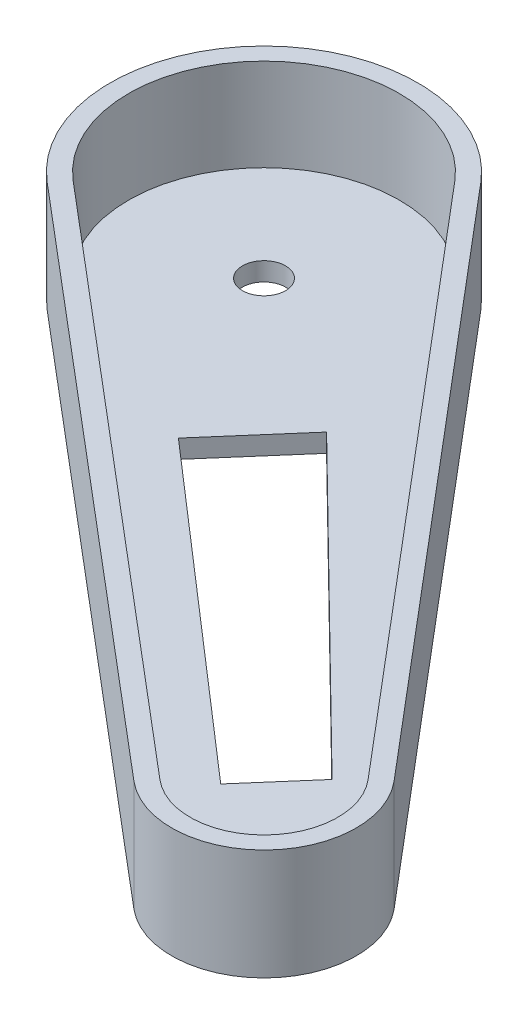
ISO-10303-21;
HEADER;
FILE_DESCRIPTION(('STEP AP214'),'2;1');
FILE_NAME('part.step','',(''),(''),'','','');
FILE_SCHEMA(('AUTOMOTIVE_DESIGN { 1 0 10303 214 1 1 1 1 }'));
ENDSEC;
DATA;
#1=APPLICATION_CONTEXT('core data for automotive mechanical design processes');
#2=APPLICATION_PROTOCOL_DEFINITION('international standard','automotive_design',2000,#1);
#3=PRODUCT_CONTEXT('',#1,'mechanical');
#4=PRODUCT('Part','Part','',(#3));
#5=PRODUCT_RELATED_PRODUCT_CATEGORY('part','',(#4));
#6=PRODUCT_DEFINITION_FORMATION('','',#4);
#7=PRODUCT_DEFINITION_CONTEXT('part definition',#1,'design');
#8=PRODUCT_DEFINITION('design','',#6,#7);
#9=PRODUCT_DEFINITION_SHAPE('','',#8);
#10=(LENGTH_UNIT() NAMED_UNIT(*) SI_UNIT(.MILLI.,.METRE.));
#11=(NAMED_UNIT(*) PLANE_ANGLE_UNIT() SI_UNIT($,.RADIAN.));
#12=(NAMED_UNIT(*) SI_UNIT($,.STERADIAN.) SOLID_ANGLE_UNIT());
#13=UNCERTAINTY_MEASURE_WITH_UNIT(LENGTH_MEASURE(1.E-05),#10,'distance_accuracy_value','');
#14=(GEOMETRIC_REPRESENTATION_CONTEXT(3) GLOBAL_UNCERTAINTY_ASSIGNED_CONTEXT((#13)) GLOBAL_UNIT_ASSIGNED_CONTEXT((#10,
#11,#12)) REPRESENTATION_CONTEXT('',''));
#15=CARTESIAN_POINT('',(0.,0.,0.));
#16=DIRECTION('',(0.,0.,1.));
#17=DIRECTION('',(1.,0.,0.));
#18=AXIS2_PLACEMENT_3D('',#15,#16,#17);
#19=CARTESIAN_POINT('',(-12.9144341357622,3.,15.2714567397174));
#20=DIRECTION('',(0.645721706788111,0.,-0.763572836985869));
#21=DIRECTION('',(-0.763572836985869,0.,-0.645721706788111));
#22=AXIS2_PLACEMENT_3D('',#19,#20,#21);
#23=PLANE('',#22);
#24=DIRECTION('',(0.763572836985869,0.,0.645721706788111));
#25=VECTOR('',#24,1.);
#26=CARTESIAN_POINT('',(-12.9144341357622,0.,15.2714567397174));
#27=LINE('',#26,#25);
#28=CARTESIAN_POINT('',(-58.5694495408956,0.,-23.3370859465461));
#29=VERTEX_POINT('',#28);
#30=CARTESIAN_POINT('',(32.7405812693714,0.,53.8799994259806));
#31=VERTEX_POINT('',#30);
#32=EDGE_CURVE('E140',#29,#31,#27,.T.);
#33=ORIENTED_EDGE('',*,*,#32,.T.);
#34=DIRECTION('',(0.,-1.,0.));
#35=VECTOR('',#34,1.);
#36=CARTESIAN_POINT('',(32.7405812693714,3.,53.8799994259806));
#37=LINE('',#36,#35);
#38=CARTESIAN_POINT('',(32.7405812693718,18.,53.8799994259802));
#39=VERTEX_POINT('',#38);
#40=EDGE_CURVE('E11',#39,#31,#37,.T.);
#41=ORIENTED_EDGE('',*,*,#40,.F.);
#42=DIRECTION('',(0.763572836985869,0.,0.645721706788111));
#43=VECTOR('',#42,1.);
#44=CARTESIAN_POINT('',(-12.9144341357622,18.,15.2714567397174));
#45=LINE('',#44,#43);
#46=CARTESIAN_POINT('',(-58.5694495408956,18.,-23.3370859465461));
#47=VERTEX_POINT('',#46);
#48=EDGE_CURVE('E138',#47,#39,#45,.T.);
#49=ORIENTED_EDGE('',*,*,#48,.F.);
#50=DIRECTION('',(0.,-1.,0.));
#51=VECTOR('',#50,1.);
#52=CARTESIAN_POINT('',(-58.5694495408956,3.,-23.3370859465461));
#53=LINE('',#52,#51);
#54=EDGE_CURVE('E275',#47,#29,#53,.T.);
#55=ORIENTED_EDGE('',*,*,#54,.T.);
#56=EDGE_LOOP('',(#33,#41,#49,#55));
#57=FACE_BOUND('',#56,.T.);
#58=ADVANCED_FACE('F47',(#57),#23,.F.);
#59=CARTESIAN_POINT('',(42.4264068711934,3.,42.4264068711923));
#60=DIRECTION('',(0.,-1.,0.));
#61=DIRECTION('',(0.,0.,-1.));
#62=AXIS2_PLACEMENT_3D('',#59,#60,#61);
#63=CYLINDRICAL_SURFACE('',#62,15.);
#64=CARTESIAN_POINT('',(42.4264068711934,0.,42.4264068711923));
#65=DIRECTION('',(0.,1.,0.));
#66=DIRECTION('',(0.,0.,1.));
#67=AXIS2_PLACEMENT_3D('',#64,#65,#66);
#68=CIRCLE('',#67,15.);
#69=CARTESIAN_POINT('',(53.8799994259812,0.,32.740581269371));
#70=VERTEX_POINT('',#69);
#71=EDGE_CURVE('E265',#31,#70,#68,.T.);
#72=ORIENTED_EDGE('',*,*,#71,.T.);
#73=DIRECTION('',(0.,-1.,0.));
#74=VECTOR('',#73,1.);
#75=CARTESIAN_POINT('',(53.8799994259812,3.,32.740581269371));
#76=LINE('',#75,#74);
#77=CARTESIAN_POINT('',(53.8799994259811,18.,32.7405812693711));
#78=VERTEX_POINT('',#77);
#79=EDGE_CURVE('E55',#78,#70,#76,.T.);
#80=ORIENTED_EDGE('',*,*,#79,.F.);
#81=CARTESIAN_POINT('',(42.4264068711934,18.,42.4264068711923));
#82=DIRECTION('',(0.,1.,0.));
#83=DIRECTION('',(0.,0.,1.));
#84=AXIS2_PLACEMENT_3D('',#81,#82,#83);
#85=CIRCLE('',#84,14.9999999999996);
#86=EDGE_CURVE('E144',#39,#78,#85,.T.);
#87=ORIENTED_EDGE('',*,*,#86,.F.);
#88=ORIENTED_EDGE('',*,*,#40,.T.);
#89=EDGE_LOOP('',(#72,#80,#87,#88));
#90=FACE_BOUND('',#89,.T.);
#91=ADVANCED_FACE('F145',(#90),#63,.T.);
#92=CARTESIAN_POINT('',(15.2714567397174,3.,-12.9144341357622));
#93=DIRECTION('',(0.763572836985869,0.,-0.645721706788111));
#94=DIRECTION('',(-0.645721706788111,0.,-0.763572836985869));
#95=AXIS2_PLACEMENT_3D('',#92,#93,#94);
#96=PLANE('',#95);
#97=DIRECTION('',(0.645721706788111,0.,0.763572836985869));
#98=VECTOR('',#97,1.);
#99=CARTESIAN_POINT('',(15.2714567397174,0.,-12.9144341357622));
#100=LINE('',#99,#98);
#101=CARTESIAN_POINT('',(-23.3370859465461,0.,-58.5694495408956));
#102=VERTEX_POINT('',#101);
#103=EDGE_CURVE('E268',#102,#70,#100,.T.);
#104=ORIENTED_EDGE('',*,*,#103,.F.);
#105=DIRECTION('',(0.,-1.,0.));
#106=VECTOR('',#105,1.);
#107=CARTESIAN_POINT('',(-23.3370859465461,3.,-58.5694495408956));
#108=LINE('',#107,#106);
#109=CARTESIAN_POINT('',(-23.3370859465461,18.,-58.5694495408956));
#110=VERTEX_POINT('',#109);
#111=EDGE_CURVE('E278',#110,#102,#108,.T.);
#112=ORIENTED_EDGE('',*,*,#111,.F.);
#113=DIRECTION('',(-0.645721706788111,0.,-0.763572836985869));
#114=VECTOR('',#113,1.);
#115=CARTESIAN_POINT('',(15.2714567397174,18.,-12.9144341357622));
#116=LINE('',#115,#114);
#117=EDGE_CURVE('E150',#78,#110,#116,.T.);
#118=ORIENTED_EDGE('',*,*,#117,.F.);
#119=ORIENTED_EDGE('',*,*,#79,.T.);
#120=EDGE_LOOP('',(#104,#112,#118,#119));
#121=FACE_BOUND('',#120,.T.);
#122=ADVANCED_FACE('F283',(#121),#96,.T.);
#123=CARTESIAN_POINT('',(-42.4264068711929,3.,-42.4264068711928));
#124=DIRECTION('',(0.,-1.,0.));
#125=DIRECTION('',(0.,0.,-1.));
#126=AXIS2_PLACEMENT_3D('',#123,#124,#125);
#127=CYLINDRICAL_SURFACE('',#126,25.);
#128=CARTESIAN_POINT('',(-42.4264068711929,0.,-42.4264068711928));
#129=DIRECTION('',(0.,1.,0.));
#130=DIRECTION('',(0.,0.,1.));
#131=AXIS2_PLACEMENT_3D('',#128,#129,#130);
#132=CIRCLE('',#131,25.);
#133=EDGE_CURVE('E272',#102,#29,#132,.T.);
#134=ORIENTED_EDGE('',*,*,#133,.T.);
#135=ORIENTED_EDGE('',*,*,#54,.F.);
#136=CARTESIAN_POINT('',(-42.4264068711929,18.,-42.4264068711928));
#137=DIRECTION('',(0.,1.,0.));
#138=DIRECTION('',(0.,0.,1.));
#139=AXIS2_PLACEMENT_3D('',#136,#137,#138);
#140=CIRCLE('',#139,25.);
#141=EDGE_CURVE('E156',#110,#47,#140,.T.);
#142=ORIENTED_EDGE('',*,*,#141,.F.);
#143=ORIENTED_EDGE('',*,*,#111,.T.);
#144=EDGE_LOOP('',(#134,#135,#142,#143));
#145=FACE_BOUND('',#144,.T.);
#146=ADVANCED_FACE('F288',(#145),#127,.T.);
#147=CARTESIAN_POINT('',(0.,3.,0.));
#148=DIRECTION('',(0.,1.,0.));
#149=DIRECTION('',(0.,0.,1.));
#150=AXIS2_PLACEMENT_3D('',#147,#148,#149);
#151=PLANE('',#150);
#152=CARTESIAN_POINT('',(-42.4264068711929,3.,-42.4264068711928));
#153=DIRECTION('',(0.,1.,0.));
#154=DIRECTION('',(0.,0.,1.));
#155=AXIS2_PLACEMENT_3D('',#152,#153,#154);
#156=CIRCLE('',#155,22.);
#157=CARTESIAN_POINT('',(-25.6278044575038,3.,-56.6322844205313));
#158=VERTEX_POINT('',#157);
#159=CARTESIAN_POINT('',(-56.6322844205313,3.,-25.6278044575037));
#160=VERTEX_POINT('',#159);
#161=EDGE_CURVE('E183',#158,#160,#156,.T.);
#162=ORIENTED_EDGE('',*,*,#161,.T.);
#163=DIRECTION('',(0.763572836985871,0.,0.645721706788109));
#164=VECTOR('',#163,1.);
#165=CARTESIAN_POINT('',(-10.9772690153977,3.,12.9807382287597));
#166=LINE('',#165,#164);
#167=CARTESIAN_POINT('',(34.6777463897358,3.,51.589280915023));
#168=VERTEX_POINT('',#167);
#169=EDGE_CURVE('E158',#160,#168,#166,.T.);
#170=ORIENTED_EDGE('',*,*,#169,.T.);
#171=CARTESIAN_POINT('',(42.4264068711934,3.,42.4264068711923));
#172=DIRECTION('',(0.,1.,0.));
#173=DIRECTION('',(0.,0.,1.));
#174=AXIS2_PLACEMENT_3D('',#171,#172,#173);
#175=CIRCLE('',#174,11.9999999999996);
#176=CARTESIAN_POINT('',(51.5892809150236,3.,34.6777463897353));
#177=VERTEX_POINT('',#176);
#178=EDGE_CURVE('E67',#168,#177,#175,.T.);
#179=ORIENTED_EDGE('',*,*,#178,.T.);
#180=DIRECTION('',(0.645721706788114,0.,0.763572836985867));
#181=VECTOR('',#180,1.);
#182=CARTESIAN_POINT('',(12.9807382287599,3.,-10.977269015398));
#183=LINE('',#182,#181);
#184=EDGE_CURVE('E62',#158,#177,#183,.T.);
#185=ORIENTED_EDGE('',*,*,#184,.F.);
#186=EDGE_LOOP('',(#162,#170,#179,#185));
#187=FACE_BOUND('',#186,.T.);
#188=DIRECTION('',(0.655504709377289,0.,-0.75519108574201));
#189=VECTOR('',#188,1.);
#190=CARTESIAN_POINT('',(30.3479863028157,3.,26.3420057746936));
#191=LINE('',#190,#189);
#192=CARTESIAN_POINT('',(25.2188438223983,3.,32.2511664920767));
#193=VERTEX_POINT('',#192);
#194=CARTESIAN_POINT('',(33.6266728578498,3.,22.5647104724889));
#195=VERTEX_POINT('',#194);
#196=EDGE_CURVE('E203',#193,#195,#191,.T.);
#197=ORIENTED_EDGE('',*,*,#196,.F.);
#198=DIRECTION('',(0.75519108574201,0.,0.655504709377289));
#199=VECTOR('',#198,1.);
#200=CARTESIAN_POINT('',(-5.12914248041741,3.,5.90916071738309));
#201=LINE('',#200,#199);
#202=CARTESIAN_POINT('',(-26.8914227625743,3.,-12.9804653402736));
#203=VERTEX_POINT('',#202);
#204=EDGE_CURVE('E209',#203,#193,#201,.T.);
#205=ORIENTED_EDGE('',*,*,#204,.F.);
#206=DIRECTION('',(-0.655504709377289,0.,0.75519108574201));
#207=VECTOR('',#206,1.);
#208=CARTESIAN_POINT('',(-21.7622802821569,3.,-18.8896260576567));
#209=LINE('',#208,#207);
#210=CARTESIAN_POINT('',(-15.7029996650353,3.,-25.8703763750824));
#211=VERTEX_POINT('',#210);
#212=EDGE_CURVE('E228',#211,#203,#209,.T.);
#213=ORIENTED_EDGE('',*,*,#212,.F.);
#214=DIRECTION('',(-0.713547212098277,0.,-0.700607148198458));
#215=VECTOR('',#214,1.);
#216=CARTESIAN_POINT('',(5.22519896008589,3.,-5.32170726521329));
#217=LINE('',#216,#215);
#218=EDGE_CURVE('E224',#195,#211,#217,.T.);
#219=ORIENTED_EDGE('',*,*,#218,.F.);
#220=EDGE_LOOP('',(#197,#205,#213,#219));
#221=FACE_BOUND('',#220,.T.);
#222=CARTESIAN_POINT('',(42.4264068711934,3.,42.4264068711923));
#223=DIRECTION('',(0.,1.,0.));
#224=DIRECTION('',(0.,0.,1.));
#225=AXIS2_PLACEMENT_3D('',#222,#223,#224);
#226=CIRCLE('',#225,3.5);
#227=CARTESIAN_POINT('',(42.4264068711934,3.,45.9264068711923));
#228=VERTEX_POINT('',#227);
#229=EDGE_CURVE('E238',#228,#228,#226,.T.);
#230=ORIENTED_EDGE('',*,*,#229,.F.);
#231=EDGE_LOOP('',(#230));
#232=FACE_BOUND('',#231,.T.);
#233=CARTESIAN_POINT('',(-42.4264068711929,3.,-42.4264068711928));
#234=DIRECTION('',(0.,1.,0.));
#235=DIRECTION('',(0.,0.,1.));
#236=AXIS2_PLACEMENT_3D('',#233,#234,#235);
#237=CIRCLE('',#236,3.5);
#238=CARTESIAN_POINT('',(-42.4264068711929,3.,-38.9264068711928));
#239=VERTEX_POINT('',#238);
#240=EDGE_CURVE('E252',#239,#239,#237,.T.);
#241=ORIENTED_EDGE('',*,*,#240,.F.);
#242=EDGE_LOOP('',(#241));
#243=FACE_BOUND('',#242,.T.);
#244=ADVANCED_FACE('F290',(#187,#221,#232,#243),#151,.T.);
#245=CARTESIAN_POINT('',(0.,0.,0.));
#246=DIRECTION('',(0.,1.,0.));
#247=DIRECTION('',(0.,0.,1.));
#248=AXIS2_PLACEMENT_3D('',#245,#246,#247);
#249=PLANE('',#248);
#250=DIRECTION('',(0.75519108574201,0.,0.655504709377289));
#251=VECTOR('',#250,1.);
#252=CARTESIAN_POINT('',(-5.12914248041741,0.,5.90916071738309));
#253=LINE('',#252,#251);
#254=CARTESIAN_POINT('',(-26.8914227625743,0.,-12.9804653402736));
#255=VERTEX_POINT('',#254);
#256=CARTESIAN_POINT('',(25.2188438223983,0.,32.2511664920767));
#257=VERTEX_POINT('',#256);
#258=EDGE_CURVE('E217',#255,#257,#253,.T.);
#259=ORIENTED_EDGE('',*,*,#258,.T.);
#260=DIRECTION('',(0.655504709377289,0.,-0.75519108574201));
#261=VECTOR('',#260,1.);
#262=CARTESIAN_POINT('',(30.3479863028157,0.,26.3420057746936));
#263=LINE('',#262,#261);
#264=CARTESIAN_POINT('',(33.6266728578498,0.,22.5647104724889));
#265=VERTEX_POINT('',#264);
#266=EDGE_CURVE('E204',#257,#265,#263,.T.);
#267=ORIENTED_EDGE('',*,*,#266,.T.);
#268=DIRECTION('',(-0.713547212098277,0.,-0.700607148198458));
#269=VECTOR('',#268,1.);
#270=CARTESIAN_POINT('',(5.22519896008589,0.,-5.32170726521329));
#271=LINE('',#270,#269);
#272=CARTESIAN_POINT('',(-15.7029996650353,0.,-25.8703763750824));
#273=VERTEX_POINT('',#272);
#274=EDGE_CURVE('E208',#265,#273,#271,.T.);
#275=ORIENTED_EDGE('',*,*,#274,.T.);
#276=DIRECTION('',(-0.655504709377289,0.,0.75519108574201));
#277=VECTOR('',#276,1.);
#278=CARTESIAN_POINT('',(-21.7622802821569,0.,-18.8896260576567));
#279=LINE('',#278,#277);
#280=EDGE_CURVE('E213',#273,#255,#279,.T.);
#281=ORIENTED_EDGE('',*,*,#280,.T.);
#282=EDGE_LOOP('',(#259,#267,#275,#281));
#283=FACE_BOUND('',#282,.T.);
#284=CARTESIAN_POINT('',(42.4264068711934,0.,42.4264068711923));
#285=DIRECTION('',(0.,1.,0.));
#286=DIRECTION('',(0.,0.,1.));
#287=AXIS2_PLACEMENT_3D('',#284,#285,#286);
#288=CIRCLE('',#287,3.5);
#289=CARTESIAN_POINT('',(42.4264068711934,0.,45.9264068711923));
#290=VERTEX_POINT('',#289);
#291=EDGE_CURVE('E248',#290,#290,#288,.T.);
#292=ORIENTED_EDGE('',*,*,#291,.T.);
#293=EDGE_LOOP('',(#292));
#294=FACE_BOUND('',#293,.T.);
#295=CARTESIAN_POINT('',(-42.4264068711929,0.,-42.4264068711928));
#296=DIRECTION('',(0.,1.,0.));
#297=DIRECTION('',(0.,0.,1.));
#298=AXIS2_PLACEMENT_3D('',#295,#296,#297);
#299=CIRCLE('',#298,3.5);
#300=CARTESIAN_POINT('',(-42.4264068711929,0.,-38.9264068711928));
#301=VERTEX_POINT('',#300);
#302=EDGE_CURVE('E256',#301,#301,#299,.T.);
#303=ORIENTED_EDGE('',*,*,#302,.T.);
#304=EDGE_LOOP('',(#303));
#305=FACE_BOUND('',#304,.T.);
#306=ORIENTED_EDGE('',*,*,#32,.F.);
#307=ORIENTED_EDGE('',*,*,#133,.F.);
#308=ORIENTED_EDGE('',*,*,#103,.T.);
#309=ORIENTED_EDGE('',*,*,#71,.F.);
#310=EDGE_LOOP('',(#306,#307,#308,#309));
#311=FACE_BOUND('',#310,.T.);
#312=ADVANCED_FACE('F286',(#283,#294,#305,#311),#249,.F.);
#313=CARTESIAN_POINT('',(-42.4264068711929,0.,-42.4264068711928));
#314=DIRECTION('',(0.,1.,0.));
#315=DIRECTION('',(0.,0.,1.));
#316=AXIS2_PLACEMENT_3D('',#313,#314,#315);
#317=CYLINDRICAL_SURFACE('',#316,3.5);
#318=ORIENTED_EDGE('',*,*,#302,.F.);
#319=EDGE_LOOP('',(#318));
#320=FACE_BOUND('',#319,.T.);
#321=ORIENTED_EDGE('',*,*,#240,.T.);
#322=EDGE_LOOP('',(#321));
#323=FACE_BOUND('',#322,.T.);
#324=ADVANCED_FACE('F404',(#320,#323),#317,.F.);
#325=CARTESIAN_POINT('',(42.4264068711934,0.,42.4264068711923));
#326=DIRECTION('',(0.,1.,0.));
#327=DIRECTION('',(0.,0.,1.));
#328=AXIS2_PLACEMENT_3D('',#325,#326,#327);
#329=CYLINDRICAL_SURFACE('',#328,3.5);
#330=ORIENTED_EDGE('',*,*,#291,.F.);
#331=EDGE_LOOP('',(#330));
#332=FACE_BOUND('',#331,.T.);
#333=ORIENTED_EDGE('',*,*,#229,.T.);
#334=EDGE_LOOP('',(#333));
#335=FACE_BOUND('',#334,.T.);
#336=ADVANCED_FACE('F400',(#332,#335),#329,.F.);
#337=CARTESIAN_POINT('',(30.3479863028157,0.,26.3420057746936));
#338=DIRECTION('',(0.75519108574201,0.,0.655504709377289));
#339=DIRECTION('',(0.655504709377289,0.,-0.75519108574201));
#340=AXIS2_PLACEMENT_3D('',#337,#338,#339);
#341=PLANE('',#340);
#342=ORIENTED_EDGE('',*,*,#196,.T.);
#343=DIRECTION('',(0.,1.,0.));
#344=VECTOR('',#343,1.);
#345=CARTESIAN_POINT('',(33.6266728578498,0.,22.5647104724889));
#346=LINE('',#345,#344);
#347=EDGE_CURVE('E221',#265,#195,#346,.T.);
#348=ORIENTED_EDGE('',*,*,#347,.F.);
#349=ORIENTED_EDGE('',*,*,#266,.F.);
#350=DIRECTION('',(0.,1.,0.));
#351=VECTOR('',#350,1.);
#352=CARTESIAN_POINT('',(25.2188438223983,0.,32.2511664920767));
#353=LINE('',#352,#351);
#354=EDGE_CURVE('E235',#257,#193,#353,.T.);
#355=ORIENTED_EDGE('',*,*,#354,.T.);
#356=EDGE_LOOP('',(#342,#348,#349,#355));
#357=FACE_BOUND('',#356,.T.);
#358=ADVANCED_FACE('F391',(#357),#341,.F.);
#359=CARTESIAN_POINT('',(-5.12914248041741,0.,5.90916071738309));
#360=DIRECTION('',(-0.655504709377289,0.,0.75519108574201));
#361=DIRECTION('',(0.75519108574201,0.,0.655504709377289));
#362=AXIS2_PLACEMENT_3D('',#359,#360,#361);
#363=PLANE('',#362);
#364=ORIENTED_EDGE('',*,*,#204,.T.);
#365=ORIENTED_EDGE('',*,*,#354,.F.);
#366=ORIENTED_EDGE('',*,*,#258,.F.);
#367=DIRECTION('',(0.,1.,0.));
#368=VECTOR('',#367,1.);
#369=CARTESIAN_POINT('',(-26.8914227625743,0.,-12.9804653402736));
#370=LINE('',#369,#368);
#371=EDGE_CURVE('E239',#255,#203,#370,.T.);
#372=ORIENTED_EDGE('',*,*,#371,.T.);
#373=EDGE_LOOP('',(#364,#365,#366,#372));
#374=FACE_BOUND('',#373,.T.);
#375=ADVANCED_FACE('F387',(#374),#363,.F.);
#376=CARTESIAN_POINT('',(-21.7622802821569,0.,-18.8896260576567));
#377=DIRECTION('',(-0.75519108574201,0.,-0.655504709377289));
#378=DIRECTION('',(-0.655504709377289,0.,0.75519108574201));
#379=AXIS2_PLACEMENT_3D('',#376,#377,#378);
#380=PLANE('',#379);
#381=ORIENTED_EDGE('',*,*,#212,.T.);
#382=ORIENTED_EDGE('',*,*,#371,.F.);
#383=ORIENTED_EDGE('',*,*,#280,.F.);
#384=DIRECTION('',(0.,1.,0.));
#385=VECTOR('',#384,1.);
#386=CARTESIAN_POINT('',(-15.7029996650353,0.,-25.8703763750824));
#387=LINE('',#386,#385);
#388=EDGE_CURVE('E242',#273,#211,#387,.T.);
#389=ORIENTED_EDGE('',*,*,#388,.T.);
#390=EDGE_LOOP('',(#381,#382,#383,#389));
#391=FACE_BOUND('',#390,.T.);
#392=ADVANCED_FACE('F390',(#391),#380,.F.);
#393=CARTESIAN_POINT('',(5.22519896008589,0.,-5.32170726521329));
#394=DIRECTION('',(0.700607148198458,0.,-0.713547212098277));
#395=DIRECTION('',(-0.713547212098277,0.,-0.700607148198458));
#396=AXIS2_PLACEMENT_3D('',#393,#394,#395);
#397=PLANE('',#396);
#398=ORIENTED_EDGE('',*,*,#218,.T.);
#399=ORIENTED_EDGE('',*,*,#388,.F.);
#400=ORIENTED_EDGE('',*,*,#274,.F.);
#401=ORIENTED_EDGE('',*,*,#347,.T.);
#402=EDGE_LOOP('',(#398,#399,#400,#401));
#403=FACE_BOUND('',#402,.T.);
#404=ADVANCED_FACE('F335',(#403),#397,.F.);
#405=CARTESIAN_POINT('',(-42.4264068711929,18.,-42.4264068711928));
#406=DIRECTION('',(0.,-1.,0.));
#407=DIRECTION('',(0.,0.,-1.));
#408=AXIS2_PLACEMENT_3D('',#405,#406,#407);
#409=CYLINDRICAL_SURFACE('',#408,22.);
#410=ORIENTED_EDGE('',*,*,#161,.F.);
#411=DIRECTION('',(0.,-1.,0.));
#412=VECTOR('',#411,1.);
#413=CARTESIAN_POINT('',(-25.6278044575038,18.,-56.6322844205313));
#414=LINE('',#413,#412);
#415=CARTESIAN_POINT('',(-25.6278044575038,18.,-56.6322844205313));
#416=VERTEX_POINT('',#415);
#417=EDGE_CURVE('E200',#416,#158,#414,.T.);
#418=ORIENTED_EDGE('',*,*,#417,.F.);
#419=CARTESIAN_POINT('',(-42.4264068711929,18.,-42.4264068711928));
#420=DIRECTION('',(0.,1.,0.));
#421=DIRECTION('',(0.,0.,1.));
#422=AXIS2_PLACEMENT_3D('',#419,#420,#421);
#423=CIRCLE('',#422,22.);
#424=CARTESIAN_POINT('',(-56.6322844205313,18.,-25.6278044575037));
#425=VERTEX_POINT('',#424);
#426=EDGE_CURVE('E167',#416,#425,#423,.T.);
#427=ORIENTED_EDGE('',*,*,#426,.T.);
#428=DIRECTION('',(0.,-1.,0.));
#429=VECTOR('',#428,1.);
#430=CARTESIAN_POINT('',(-56.6322844205313,18.,-25.6278044575037));
#431=LINE('',#430,#429);
#432=EDGE_CURVE('E182',#425,#160,#431,.T.);
#433=ORIENTED_EDGE('',*,*,#432,.T.);
#434=EDGE_LOOP('',(#410,#418,#427,#433));
#435=FACE_BOUND('',#434,.T.);
#436=ADVANCED_FACE('F328',(#435),#409,.F.);
#437=CARTESIAN_POINT('',(12.9807382287599,18.,-10.977269015398));
#438=DIRECTION('',(0.763572836985867,0.,-0.645721706788114));
#439=DIRECTION('',(-0.645721706788114,0.,-0.763572836985867));
#440=AXIS2_PLACEMENT_3D('',#437,#438,#439);
#441=PLANE('',#440);
#442=ORIENTED_EDGE('',*,*,#184,.T.);
#443=DIRECTION('',(0.,-1.,0.));
#444=VECTOR('',#443,1.);
#445=CARTESIAN_POINT('',(51.5892809150236,18.,34.6777463897353));
#446=LINE('',#445,#444);
#447=CARTESIAN_POINT('',(51.5892809150236,18.,34.6777463897353));
#448=VERTEX_POINT('',#447);
#449=EDGE_CURVE('E197',#448,#177,#446,.T.);
#450=ORIENTED_EDGE('',*,*,#449,.F.);
#451=DIRECTION('',(0.645721706788114,0.,0.763572836985867));
#452=VECTOR('',#451,1.);
#453=CARTESIAN_POINT('',(12.9807382287599,18.,-10.977269015398));
#454=LINE('',#453,#452);
#455=EDGE_CURVE('E171',#416,#448,#454,.T.);
#456=ORIENTED_EDGE('',*,*,#455,.F.);
#457=ORIENTED_EDGE('',*,*,#417,.T.);
#458=EDGE_LOOP('',(#442,#450,#456,#457));
#459=FACE_BOUND('',#458,.T.);
#460=ADVANCED_FACE('F334',(#459),#441,.F.);
#461=CARTESIAN_POINT('',(42.4264068711934,18.,42.4264068711923));
#462=DIRECTION('',(0.,-1.,0.));
#463=DIRECTION('',(0.,0.,-1.));
#464=AXIS2_PLACEMENT_3D('',#461,#462,#463);
#465=CYLINDRICAL_SURFACE('',#464,11.9999999999996);
#466=ORIENTED_EDGE('',*,*,#178,.F.);
#467=DIRECTION('',(0.,-1.,0.));
#468=VECTOR('',#467,1.);
#469=CARTESIAN_POINT('',(34.6777463897358,18.,51.589280915023));
#470=LINE('',#469,#468);
#471=CARTESIAN_POINT('',(34.6777463897358,18.,51.589280915023));
#472=VERTEX_POINT('',#471);
#473=EDGE_CURVE('E193',#472,#168,#470,.T.);
#474=ORIENTED_EDGE('',*,*,#473,.F.);
#475=CARTESIAN_POINT('',(42.4264068711934,18.,42.4264068711923));
#476=DIRECTION('',(0.,1.,0.));
#477=DIRECTION('',(0.,0.,1.));
#478=AXIS2_PLACEMENT_3D('',#475,#476,#477);
#479=CIRCLE('',#478,11.9999999999996);
#480=EDGE_CURVE('E174',#472,#448,#479,.T.);
#481=ORIENTED_EDGE('',*,*,#480,.T.);
#482=ORIENTED_EDGE('',*,*,#449,.T.);
#483=EDGE_LOOP('',(#466,#474,#481,#482));
#484=FACE_BOUND('',#483,.T.);
#485=ADVANCED_FACE('F346',(#484),#465,.F.);
#486=CARTESIAN_POINT('',(-10.9772690153977,18.,12.9807382287597));
#487=DIRECTION('',(0.645721706788109,0.,-0.763572836985871));
#488=DIRECTION('',(-0.763572836985871,0.,-0.645721706788109));
#489=AXIS2_PLACEMENT_3D('',#486,#487,#488);
#490=PLANE('',#489);
#491=ORIENTED_EDGE('',*,*,#169,.F.);
#492=ORIENTED_EDGE('',*,*,#432,.F.);
#493=DIRECTION('',(0.763572836985871,0.,0.645721706788109));
#494=VECTOR('',#493,1.);
#495=CARTESIAN_POINT('',(-10.9772690153977,18.,12.9807382287597));
#496=LINE('',#495,#494);
#497=EDGE_CURVE('E178',#425,#472,#496,.T.);
#498=ORIENTED_EDGE('',*,*,#497,.T.);
#499=ORIENTED_EDGE('',*,*,#473,.T.);
#500=EDGE_LOOP('',(#491,#492,#498,#499));
#501=FACE_BOUND('',#500,.T.);
#502=ADVANCED_FACE('F356',(#501),#490,.T.);
#503=CARTESIAN_POINT('',(0.,18.,0.));
#504=DIRECTION('',(0.,1.,0.));
#505=DIRECTION('',(0.,0.,1.));
#506=AXIS2_PLACEMENT_3D('',#503,#504,#505);
#507=PLANE('',#506);
#508=ORIENTED_EDGE('',*,*,#48,.T.);
#509=ORIENTED_EDGE('',*,*,#86,.T.);
#510=ORIENTED_EDGE('',*,*,#117,.T.);
#511=ORIENTED_EDGE('',*,*,#141,.T.);
#512=EDGE_LOOP('',(#508,#509,#510,#511));
#513=FACE_BOUND('',#512,.T.);
#514=ORIENTED_EDGE('',*,*,#426,.F.);
#515=ORIENTED_EDGE('',*,*,#455,.T.);
#516=ORIENTED_EDGE('',*,*,#480,.F.);
#517=ORIENTED_EDGE('',*,*,#497,.F.);
#518=EDGE_LOOP('',(#514,#515,#516,#517));
#519=FACE_BOUND('',#518,.T.);
#520=ADVANCED_FACE('F153',(#513,#519),#507,.T.);
#521=CLOSED_SHELL('',(#58,#91,#122,#146,#244,#312,#324,#336,#358,#375,#392,#404,#436,#460,#485,
#502,#520));
#522=MANIFOLD_SOLID_BREP('B2',#521);
#523=ADVANCED_BREP_SHAPE_REPRESENTATION('',(#18,#522),#14);
#524=SHAPE_DEFINITION_REPRESENTATION(#9,#523);
ENDSEC;
END-ISO-10303-21;
